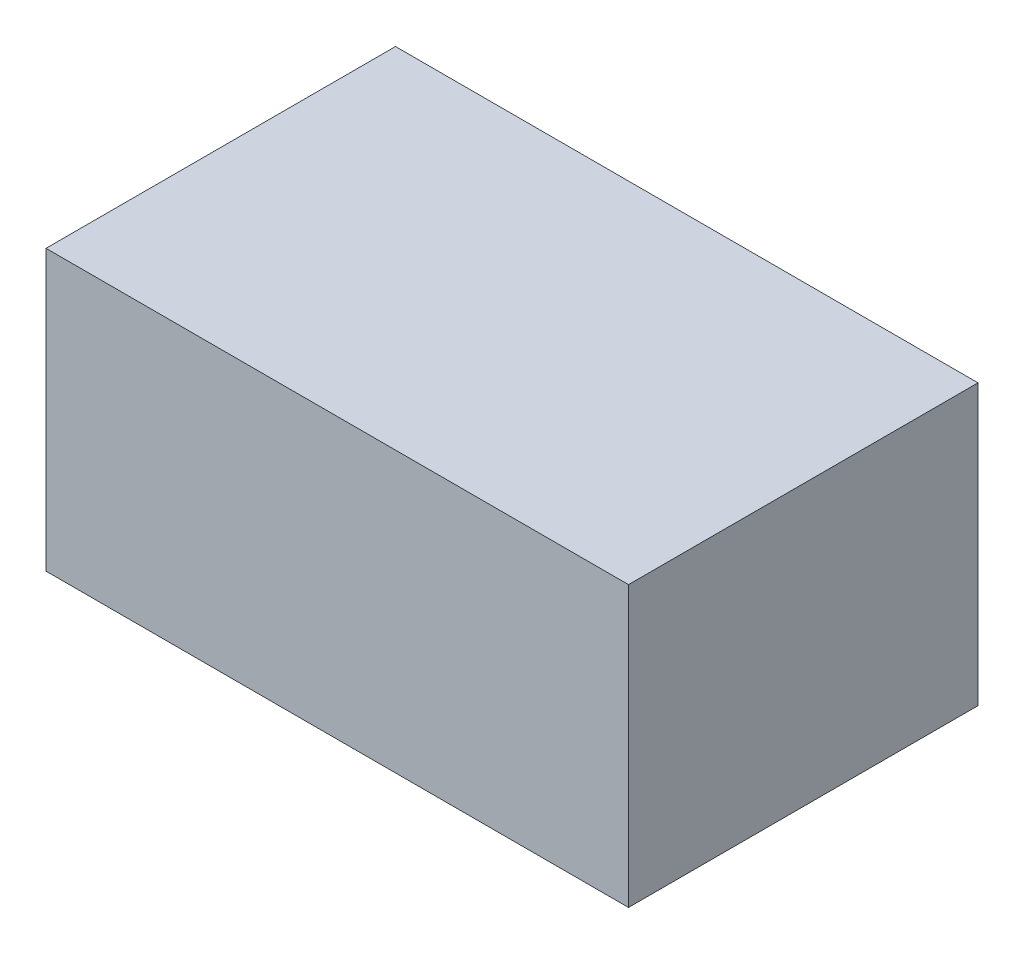
ISO-10303-21;
HEADER;
FILE_DESCRIPTION(('STEP AP214'),'2;1');
FILE_NAME('part.step','',(''),(''),'','','');
FILE_SCHEMA(('AUTOMOTIVE_DESIGN { 1 0 10303 214 1 1 1 1 }'));
ENDSEC;
DATA;
#1=APPLICATION_CONTEXT('core data for automotive mechanical design processes');
#2=APPLICATION_PROTOCOL_DEFINITION('international standard','automotive_design',2000,#1);
#3=PRODUCT_CONTEXT('',#1,'mechanical');
#4=PRODUCT('Part','Part','',(#3));
#5=PRODUCT_RELATED_PRODUCT_CATEGORY('part','',(#4));
#6=PRODUCT_DEFINITION_FORMATION('','',#4);
#7=PRODUCT_DEFINITION_CONTEXT('part definition',#1,'design');
#8=PRODUCT_DEFINITION('design','',#6,#7);
#9=PRODUCT_DEFINITION_SHAPE('','',#8);
#10=(LENGTH_UNIT() NAMED_UNIT(*) SI_UNIT(.MILLI.,.METRE.));
#11=(NAMED_UNIT(*) PLANE_ANGLE_UNIT() SI_UNIT($,.RADIAN.));
#12=(NAMED_UNIT(*) SI_UNIT($,.STERADIAN.) SOLID_ANGLE_UNIT());
#13=UNCERTAINTY_MEASURE_WITH_UNIT(LENGTH_MEASURE(1.E-05),#10,'distance_accuracy_value','');
#14=(GEOMETRIC_REPRESENTATION_CONTEXT(3) GLOBAL_UNCERTAINTY_ASSIGNED_CONTEXT((#13)) GLOBAL_UNIT_ASSIGNED_CONTEXT((#10,
#11,#12)) REPRESENTATION_CONTEXT('',''));
#15=CARTESIAN_POINT('',(0.,0.,0.));
#16=DIRECTION('',(0.,0.,1.));
#17=DIRECTION('',(1.,0.,0.));
#18=AXIS2_PLACEMENT_3D('',#15,#16,#17);
#19=CARTESIAN_POINT('',(2.54,1.2192,0.));
#20=DIRECTION('',(0.,-1.,0.));
#21=DIRECTION('',(0.,0.,-1.));
#22=AXIS2_PLACEMENT_3D('',#19,#20,#21);
#23=PLANE('',#22);
#24=DIRECTION('',(0.,0.,-1.));
#25=VECTOR('',#24,1.);
#26=CARTESIAN_POINT('',(-2.54,1.2192,0.));
#27=LINE('',#26,#25);
#28=CARTESIAN_POINT('',(-2.54,1.2192,0.));
#29=VERTEX_POINT('',#28);
#30=CARTESIAN_POINT('',(-2.54,1.2192,3.048));
#31=VERTEX_POINT('',#30);
#32=EDGE_CURVE('E20',#29,#31,#27,.F.);
#33=ORIENTED_EDGE('',*,*,#32,.T.);
#34=DIRECTION('',(-1.,0.,0.));
#35=VECTOR('',#34,1.);
#36=CARTESIAN_POINT('',(-2.54,1.2192,3.048));
#37=LINE('',#36,#35);
#38=CARTESIAN_POINT('',(2.54,1.2192,3.048));
#39=VERTEX_POINT('',#38);
#40=EDGE_CURVE('E55',#31,#39,#37,.F.);
#41=ORIENTED_EDGE('',*,*,#40,.T.);
#42=DIRECTION('',(0.,0.,1.));
#43=VECTOR('',#42,1.);
#44=CARTESIAN_POINT('',(2.54,1.2192,0.));
#45=LINE('',#44,#43);
#46=CARTESIAN_POINT('',(2.54,1.2192,0.));
#47=VERTEX_POINT('',#46);
#48=EDGE_CURVE('E74',#39,#47,#45,.F.);
#49=ORIENTED_EDGE('',*,*,#48,.T.);
#50=DIRECTION('',(-1.,0.,0.));
#51=VECTOR('',#50,1.);
#52=CARTESIAN_POINT('',(-2.54,1.2192,0.));
#53=LINE('',#52,#51);
#54=EDGE_CURVE('E66',#29,#47,#53,.F.);
#55=ORIENTED_EDGE('',*,*,#54,.F.);
#56=EDGE_LOOP('',(#33,#41,#49,#55));
#57=FACE_BOUND('',#56,.T.);
#58=ADVANCED_FACE('F17',(#57),#23,.F.);
#59=CARTESIAN_POINT('',(-2.54,1.2192,0.));
#60=DIRECTION('',(1.,0.,0.));
#61=DIRECTION('',(0.,0.,-1.));
#62=AXIS2_PLACEMENT_3D('',#59,#60,#61);
#63=PLANE('',#62);
#64=DIRECTION('',(0.,0.,1.));
#65=VECTOR('',#64,1.);
#66=CARTESIAN_POINT('',(-2.54,-1.2192,0.));
#67=LINE('',#66,#65);
#68=CARTESIAN_POINT('',(-2.54,-1.2192,0.));
#69=VERTEX_POINT('',#68);
#70=CARTESIAN_POINT('',(-2.54,-1.2192,3.048));
#71=VERTEX_POINT('',#70);
#72=EDGE_CURVE('E72',#69,#71,#67,.T.);
#73=ORIENTED_EDGE('',*,*,#72,.T.);
#74=DIRECTION('',(0.,1.,0.));
#75=VECTOR('',#74,1.);
#76=CARTESIAN_POINT('',(-2.54,1.2192,3.048));
#77=LINE('',#76,#75);
#78=EDGE_CURVE('E62',#71,#31,#77,.T.);
#79=ORIENTED_EDGE('',*,*,#78,.T.);
#80=ORIENTED_EDGE('',*,*,#32,.F.);
#81=DIRECTION('',(0.,1.,0.));
#82=VECTOR('',#81,1.);
#83=CARTESIAN_POINT('',(-2.54,1.2192,0.));
#84=LINE('',#83,#82);
#85=EDGE_CURVE('E80',#69,#29,#84,.T.);
#86=ORIENTED_EDGE('',*,*,#85,.F.);
#87=EDGE_LOOP('',(#73,#79,#80,#86));
#88=FACE_BOUND('',#87,.T.);
#89=ADVANCED_FACE('F71',(#88),#63,.F.);
#90=CARTESIAN_POINT('',(-2.54,1.2192,3.048));
#91=DIRECTION('',(0.,0.,-1.));
#92=DIRECTION('',(-1.,0.,0.));
#93=AXIS2_PLACEMENT_3D('',#90,#91,#92);
#94=PLANE('',#93);
#95=DIRECTION('',(1.,0.,0.));
#96=VECTOR('',#95,1.);
#97=CARTESIAN_POINT('',(-2.54,-1.2192,3.048));
#98=LINE('',#97,#96);
#99=CARTESIAN_POINT('',(2.54,-1.2192,3.048));
#100=VERTEX_POINT('',#99);
#101=EDGE_CURVE('E83',#71,#100,#98,.T.);
#102=ORIENTED_EDGE('',*,*,#101,.T.);
#103=DIRECTION('',(0.,1.,0.));
#104=VECTOR('',#103,1.);
#105=CARTESIAN_POINT('',(2.54,-1.2192,3.048));
#106=LINE('',#105,#104);
#107=EDGE_CURVE('E64',#100,#39,#106,.T.);
#108=ORIENTED_EDGE('',*,*,#107,.T.);
#109=ORIENTED_EDGE('',*,*,#40,.F.);
#110=ORIENTED_EDGE('',*,*,#78,.F.);
#111=EDGE_LOOP('',(#102,#108,#109,#110));
#112=FACE_BOUND('',#111,.T.);
#113=ADVANCED_FACE('F60',(#112),#94,.F.);
#114=CARTESIAN_POINT('',(2.54,-1.2192,0.));
#115=DIRECTION('',(-1.,0.,0.));
#116=DIRECTION('',(0.,0.,1.));
#117=AXIS2_PLACEMENT_3D('',#114,#115,#116);
#118=PLANE('',#117);
#119=ORIENTED_EDGE('',*,*,#48,.F.);
#120=ORIENTED_EDGE('',*,*,#107,.F.);
#121=DIRECTION('',(0.,0.,1.));
#122=VECTOR('',#121,1.);
#123=CARTESIAN_POINT('',(2.54,-1.2192,0.));
#124=LINE('',#123,#122);
#125=CARTESIAN_POINT('',(2.54,-1.2192,0.));
#126=VERTEX_POINT('',#125);
#127=EDGE_CURVE('E26',#100,#126,#124,.F.);
#128=ORIENTED_EDGE('',*,*,#127,.T.);
#129=DIRECTION('',(0.,1.,0.));
#130=VECTOR('',#129,1.);
#131=CARTESIAN_POINT('',(2.54,1.2192,0.));
#132=LINE('',#131,#130);
#133=EDGE_CURVE('E34',#47,#126,#132,.F.);
#134=ORIENTED_EDGE('',*,*,#133,.F.);
#135=EDGE_LOOP('',(#119,#120,#128,#134));
#136=FACE_BOUND('',#135,.T.);
#137=ADVANCED_FACE('F88',(#136),#118,.F.);
#138=CARTESIAN_POINT('',(-2.54,1.2192,0.));
#139=DIRECTION('',(0.,0.,-1.));
#140=DIRECTION('',(-1.,0.,0.));
#141=AXIS2_PLACEMENT_3D('',#138,#139,#140);
#142=PLANE('',#141);
#143=DIRECTION('',(1.,0.,0.));
#144=VECTOR('',#143,1.);
#145=CARTESIAN_POINT('',(-2.54,-1.2192,0.));
#146=LINE('',#145,#144);
#147=EDGE_CURVE('E11',#126,#69,#146,.F.);
#148=ORIENTED_EDGE('',*,*,#147,.T.);
#149=ORIENTED_EDGE('',*,*,#85,.T.);
#150=ORIENTED_EDGE('',*,*,#54,.T.);
#151=ORIENTED_EDGE('',*,*,#133,.T.);
#152=EDGE_LOOP('',(#148,#149,#150,#151));
#153=FACE_BOUND('',#152,.T.);
#154=ADVANCED_FACE('F91',(#153),#142,.T.);
#155=CARTESIAN_POINT('',(-2.54,-1.2192,0.));
#156=DIRECTION('',(0.,1.,0.));
#157=DIRECTION('',(0.,0.,1.));
#158=AXIS2_PLACEMENT_3D('',#155,#156,#157);
#159=PLANE('',#158);
#160=ORIENTED_EDGE('',*,*,#127,.F.);
#161=ORIENTED_EDGE('',*,*,#101,.F.);
#162=ORIENTED_EDGE('',*,*,#72,.F.);
#163=ORIENTED_EDGE('',*,*,#147,.F.);
#164=EDGE_LOOP('',(#160,#161,#162,#163));
#165=FACE_BOUND('',#164,.T.);
#166=ADVANCED_FACE('F90',(#165),#159,.F.);
#167=CLOSED_SHELL('',(#58,#89,#113,#137,#154,#166));
#168=MANIFOLD_SOLID_BREP('B1',#167);
#169=ADVANCED_BREP_SHAPE_REPRESENTATION('',(#18,#168),#14);
#170=SHAPE_DEFINITION_REPRESENTATION(#9,#169);
ENDSEC;
END-ISO-10303-21;
